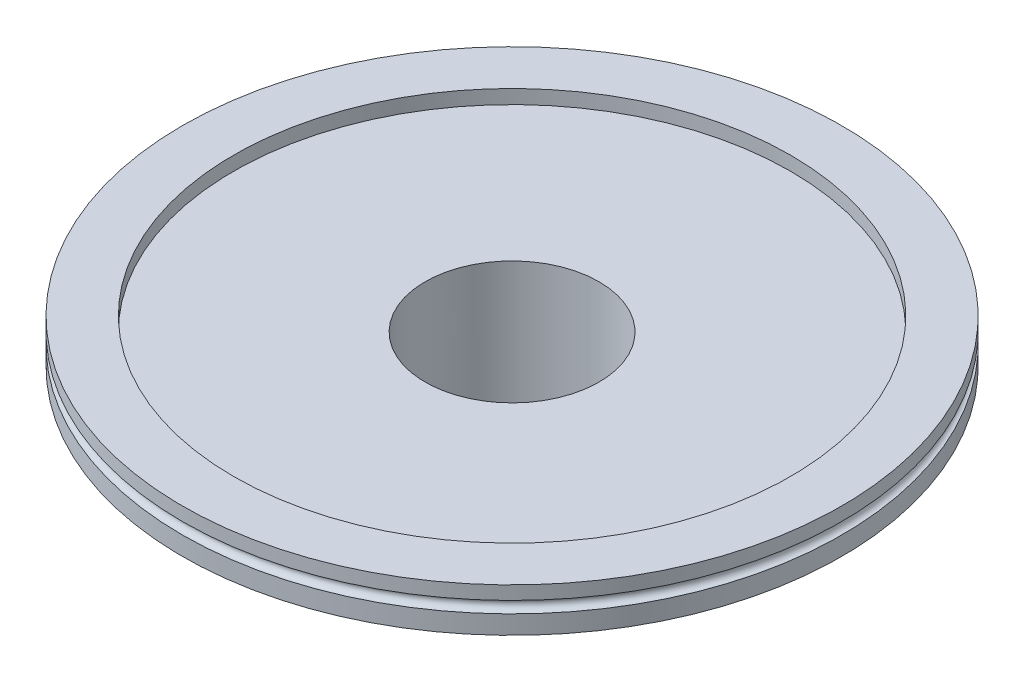
ISO-10303-21;
HEADER;
FILE_DESCRIPTION(('STEP AP214'),'2;1');
FILE_NAME('part.step','',(''),(''),'','','');
FILE_SCHEMA(('AUTOMOTIVE_DESIGN { 1 0 10303 214 1 1 1 1 }'));
ENDSEC;
DATA;
#1=APPLICATION_CONTEXT('core data for automotive mechanical design processes');
#2=APPLICATION_PROTOCOL_DEFINITION('international standard','automotive_design',2000,#1);
#3=PRODUCT_CONTEXT('',#1,'mechanical');
#4=PRODUCT('Part','Part','',(#3));
#5=PRODUCT_RELATED_PRODUCT_CATEGORY('part','',(#4));
#6=PRODUCT_DEFINITION_FORMATION('','',#4);
#7=PRODUCT_DEFINITION_CONTEXT('part definition',#1,'design');
#8=PRODUCT_DEFINITION('design','',#6,#7);
#9=PRODUCT_DEFINITION_SHAPE('','',#8);
#10=(LENGTH_UNIT() NAMED_UNIT(*) SI_UNIT(.MILLI.,.METRE.));
#11=(NAMED_UNIT(*) PLANE_ANGLE_UNIT() SI_UNIT($,.RADIAN.));
#12=(NAMED_UNIT(*) SI_UNIT($,.STERADIAN.) SOLID_ANGLE_UNIT());
#13=UNCERTAINTY_MEASURE_WITH_UNIT(LENGTH_MEASURE(1.E-05),#10,'distance_accuracy_value','');
#14=(GEOMETRIC_REPRESENTATION_CONTEXT(3) GLOBAL_UNCERTAINTY_ASSIGNED_CONTEXT((#13)) GLOBAL_UNIT_ASSIGNED_CONTEXT((#10,
#11,#12)) REPRESENTATION_CONTEXT('',''));
#15=CARTESIAN_POINT('',(0.,0.,0.));
#16=DIRECTION('',(0.,0.,1.));
#17=DIRECTION('',(1.,0.,0.));
#18=AXIS2_PLACEMENT_3D('',#15,#16,#17);
#19=CARTESIAN_POINT('',(0.,5.96900000000001,0.));
#20=DIRECTION('',(0.,1.,0.));
#21=DIRECTION('',(-1.,0.,0.));
#22=AXIS2_PLACEMENT_3D('',#19,#20,#21);
#23=CYLINDRICAL_SURFACE('',#22,89.9999999971);
#24=CARTESIAN_POINT('',(0.,2.28599999999998,0.));
#25=DIRECTION('',(0.,1.,0.));
#26=DIRECTION('',(0.,0.,1.));
#27=AXIS2_PLACEMENT_3D('',#24,#25,#26);
#28=CIRCLE('',#27,89.9999999971);
#29=CARTESIAN_POINT('',(0.,2.28599999999998,89.9999999971));
#30=VERTEX_POINT('',#29);
#31=EDGE_CURVE('E98',#30,#30,#28,.T.);
#32=ORIENTED_EDGE('',*,*,#31,.T.);
#33=EDGE_LOOP('',(#32));
#34=FACE_BOUND('',#33,.T.);
#35=CARTESIAN_POINT('',(0.,5.969,0.));
#36=DIRECTION('',(0.,1.,0.));
#37=DIRECTION('',(-1.,0.,0.));
#38=AXIS2_PLACEMENT_3D('',#35,#36,#37);
#39=CIRCLE('',#38,89.9999999971);
#40=CARTESIAN_POINT('',(-89.9999999971,5.96899999999998,0.));
#41=VERTEX_POINT('',#40);
#42=EDGE_CURVE('E49',#41,#41,#39,.T.);
#43=ORIENTED_EDGE('',*,*,#42,.F.);
#44=EDGE_LOOP('',(#43));
#45=FACE_BOUND('',#44,.T.);
#46=ADVANCED_FACE('F36',(#34,#45),#23,.T.);
#47=CARTESIAN_POINT('',(-89.9999999971,-5.96900000000001,0.));
#48=DIRECTION('',(0.,-1.,0.));
#49=DIRECTION('',(1.,0.,0.));
#50=AXIS2_PLACEMENT_3D('',#47,#48,#49);
#51=PLANE('',#50);
#52=CARTESIAN_POINT('',(0.,-5.96900000000001,0.));
#53=DIRECTION('',(0.,1.,0.));
#54=DIRECTION('',(0.,0.,1.));
#55=AXIS2_PLACEMENT_3D('',#52,#53,#54);
#56=CIRCLE('',#55,87.4599999971);
#57=CARTESIAN_POINT('',(0.,-5.96900000000001,87.4599999971));
#58=VERTEX_POINT('',#57);
#59=EDGE_CURVE('E97',#58,#58,#56,.T.);
#60=ORIENTED_EDGE('',*,*,#59,.T.);
#61=EDGE_LOOP('',(#60));
#62=FACE_BOUND('',#61,.T.);
#63=CARTESIAN_POINT('',(0.,-5.969,0.));
#64=DIRECTION('',(0.,1.,0.));
#65=DIRECTION('',(-1.,0.,0.));
#66=AXIS2_PLACEMENT_3D('',#63,#64,#65);
#67=CIRCLE('',#66,89.9999999971);
#68=CARTESIAN_POINT('',(-89.9999999971,-5.96900000000001,0.));
#69=VERTEX_POINT('',#68);
#70=EDGE_CURVE('E44',#69,#69,#67,.T.);
#71=ORIENTED_EDGE('',*,*,#70,.F.);
#72=EDGE_LOOP('',(#71));
#73=FACE_BOUND('',#72,.T.);
#74=ADVANCED_FACE('F70',(#62,#73),#51,.T.);
#75=CARTESIAN_POINT('',(0.,0.,0.));
#76=DIRECTION('',(0.,1.,0.));
#77=DIRECTION('',(0.,0.,1.));
#78=AXIS2_PLACEMENT_3D('',#75,#76,#77);
#79=CYLINDRICAL_SURFACE('',#78,25.4);
#80=CARTESIAN_POINT('',(0.,-5.969,0.));
#81=DIRECTION('',(0.,-1.,0.));
#82=DIRECTION('',(1.,0.,0.));
#83=AXIS2_PLACEMENT_3D('',#80,#81,#82);
#84=CIRCLE('',#83,25.4);
#85=CARTESIAN_POINT('',(25.4,-5.969,0.));
#86=VERTEX_POINT('',#85);
#87=EDGE_CURVE('E10',#86,#86,#84,.T.);
#88=ORIENTED_EDGE('',*,*,#87,.T.);
#89=EDGE_LOOP('',(#88));
#90=FACE_BOUND('',#89,.T.);
#91=CARTESIAN_POINT('',(0.,-34.925,0.));
#92=DIRECTION('',(0.,-1.,0.));
#93=DIRECTION('',(1.,0.,0.));
#94=AXIS2_PLACEMENT_3D('',#91,#92,#93);
#95=CIRCLE('',#94,25.4);
#96=CARTESIAN_POINT('',(25.4,-34.925,0.));
#97=VERTEX_POINT('',#96);
#98=EDGE_CURVE('E40',#97,#97,#95,.F.);
#99=ORIENTED_EDGE('',*,*,#98,.T.);
#100=EDGE_LOOP('',(#99));
#101=FACE_BOUND('',#100,.T.);
#102=ADVANCED_FACE('F76',(#90,#101),#79,.T.);
#103=CARTESIAN_POINT('',(0.,-5.96900000000001,0.));
#104=DIRECTION('',(0.,1.,0.));
#105=DIRECTION('',(0.,0.,1.));
#106=AXIS2_PLACEMENT_3D('',#103,#104,#105);
#107=CIRCLE('',#106,82.3799999971);
#108=CARTESIAN_POINT('',(0.,-5.96900000000001,82.3799999971));
#109=VERTEX_POINT('',#108);
#110=EDGE_CURVE('E101',#109,#109,#107,.T.);
#111=ORIENTED_EDGE('',*,*,#110,.F.);
#112=EDGE_LOOP('',(#111));
#113=FACE_BOUND('',#112,.T.);
#114=ORIENTED_EDGE('',*,*,#87,.F.);
#115=EDGE_LOOP('',(#114));
#116=FACE_BOUND('',#115,.T.);
#117=ADVANCED_FACE('F38',(#113,#116),#51,.T.);
#118=CARTESIAN_POINT('',(-89.9999999971,5.96899999999999,0.));
#119=DIRECTION('',(0.,1.,0.));
#120=DIRECTION('',(-1.,0.,0.));
#121=AXIS2_PLACEMENT_3D('',#118,#119,#120);
#122=PLANE('',#121);
#123=ORIENTED_EDGE('',*,*,#42,.T.);
#124=EDGE_LOOP('',(#123));
#125=FACE_BOUND('',#124,.T.);
#126=CARTESIAN_POINT('',(0.,5.96900000000001,0.));
#127=DIRECTION('',(0.,-1.,0.));
#128=DIRECTION('',(0.,0.,-1.));
#129=AXIS2_PLACEMENT_3D('',#126,#127,#128);
#130=CIRCLE('',#129,76.0299999971);
#131=CARTESIAN_POINT('',(0.,5.96900000000001,-76.0299999971));
#132=VERTEX_POINT('',#131);
#133=EDGE_CURVE('E54',#132,#132,#130,.T.);
#134=ORIENTED_EDGE('',*,*,#133,.T.);
#135=EDGE_LOOP('',(#134));
#136=FACE_BOUND('',#135,.T.);
#137=ADVANCED_FACE('F66',(#125,#136),#122,.T.);
#138=CARTESIAN_POINT('',(0.,-0.889000000000015,0.));
#139=DIRECTION('',(0.,1.,0.));
#140=DIRECTION('',(0.,0.,1.));
#141=AXIS2_PLACEMENT_3D('',#138,#139,#140);
#142=CIRCLE('',#141,89.9999999971);
#143=CARTESIAN_POINT('',(0.,-0.889000000000015,89.9999999971));
#144=VERTEX_POINT('',#143);
#145=EDGE_CURVE('E93',#144,#144,#142,.T.);
#146=ORIENTED_EDGE('',*,*,#145,.F.);
#147=EDGE_LOOP('',(#146));
#148=FACE_BOUND('',#147,.T.);
#149=ORIENTED_EDGE('',*,*,#70,.T.);
#150=EDGE_LOOP('',(#149));
#151=FACE_BOUND('',#150,.T.);
#152=ADVANCED_FACE('F72',(#148,#151),#23,.T.);
#153=CARTESIAN_POINT('',(0.,5.96900000000001,0.));
#154=DIRECTION('',(0.,-1.,0.));
#155=DIRECTION('',(0.,0.,-1.));
#156=AXIS2_PLACEMENT_3D('',#153,#154,#155);
#157=CYLINDRICAL_SURFACE('',#156,23.749);
#158=CARTESIAN_POINT('',(0.,-37.3888,0.));
#159=DIRECTION('',(0.,1.,0.));
#160=DIRECTION('',(0.,0.,1.));
#161=AXIS2_PLACEMENT_3D('',#158,#159,#160);
#162=CIRCLE('',#161,23.749);
#163=CARTESIAN_POINT('',(0.,-37.3888,23.749));
#164=VERTEX_POINT('',#163);
#165=EDGE_CURVE('E52',#164,#164,#162,.T.);
#166=ORIENTED_EDGE('',*,*,#165,.F.);
#167=EDGE_LOOP('',(#166));
#168=FACE_BOUND('',#167,.T.);
#169=CARTESIAN_POINT('',(0.,2.15900000000001,0.));
#170=DIRECTION('',(0.,-1.,0.));
#171=DIRECTION('',(0.,0.,-1.));
#172=AXIS2_PLACEMENT_3D('',#169,#170,#171);
#173=CIRCLE('',#172,23.749);
#174=CARTESIAN_POINT('',(0.,2.15900000000001,-23.749));
#175=VERTEX_POINT('',#174);
#176=EDGE_CURVE('E60',#175,#175,#173,.T.);
#177=ORIENTED_EDGE('',*,*,#176,.F.);
#178=EDGE_LOOP('',(#177));
#179=FACE_BOUND('',#178,.T.);
#180=ADVANCED_FACE('F81',(#168,#179),#157,.F.);
#181=CARTESIAN_POINT('',(-23.749,2.159,0.));
#182=DIRECTION('',(0.,1.,0.));
#183=DIRECTION('',(0.,0.,1.));
#184=AXIS2_PLACEMENT_3D('',#181,#182,#183);
#185=PLANE('',#184);
#186=CARTESIAN_POINT('',(0.,2.159,0.));
#187=DIRECTION('',(0.,-1.,0.));
#188=DIRECTION('',(0.,0.,-1.));
#189=AXIS2_PLACEMENT_3D('',#186,#187,#188);
#190=CIRCLE('',#189,76.0299999971);
#191=CARTESIAN_POINT('',(0.,2.159,-76.0299999971));
#192=VERTEX_POINT('',#191);
#193=EDGE_CURVE('E57',#192,#192,#190,.T.);
#194=ORIENTED_EDGE('',*,*,#193,.F.);
#195=EDGE_LOOP('',(#194));
#196=FACE_BOUND('',#195,.T.);
#197=ORIENTED_EDGE('',*,*,#176,.T.);
#198=EDGE_LOOP('',(#197));
#199=FACE_BOUND('',#198,.T.);
#200=ADVANCED_FACE('F87',(#196,#199),#185,.T.);
#201=CARTESIAN_POINT('',(0.,5.96900000000001,0.));
#202=DIRECTION('',(0.,-1.,0.));
#203=DIRECTION('',(0.,0.,-1.));
#204=AXIS2_PLACEMENT_3D('',#201,#202,#203);
#205=CYLINDRICAL_SURFACE('',#204,76.0299999971);
#206=ORIENTED_EDGE('',*,*,#193,.T.);
#207=EDGE_LOOP('',(#206));
#208=FACE_BOUND('',#207,.T.);
#209=ORIENTED_EDGE('',*,*,#133,.F.);
#210=EDGE_LOOP('',(#209));
#211=FACE_BOUND('',#210,.T.);
#212=ADVANCED_FACE('F140',(#208,#211),#205,.F.);
#213=CARTESIAN_POINT('',(-23.749,-37.3888,0.));
#214=DIRECTION('',(0.,-1.,0.));
#215=DIRECTION('',(0.,0.,-1.));
#216=AXIS2_PLACEMENT_3D('',#213,#214,#215);
#217=PLANE('',#216);
#218=ORIENTED_EDGE('',*,*,#165,.T.);
#219=EDGE_LOOP('',(#218));
#220=FACE_BOUND('',#219,.T.);
#221=CARTESIAN_POINT('',(0.,-37.3888,0.));
#222=DIRECTION('',(0.,1.,0.));
#223=DIRECTION('',(-1.,0.,0.));
#224=AXIS2_PLACEMENT_3D('',#221,#222,#223);
#225=CIRCLE('',#224,26.1239);
#226=CARTESIAN_POINT('',(-26.1239,-37.3888,0.));
#227=VERTEX_POINT('',#226);
#228=EDGE_CURVE('E124',#227,#227,#225,.T.);
#229=ORIENTED_EDGE('',*,*,#228,.F.);
#230=EDGE_LOOP('',(#229));
#231=FACE_BOUND('',#230,.T.);
#232=ADVANCED_FACE('F134',(#220,#231),#217,.T.);
#233=CARTESIAN_POINT('',(0.,5.96900000000001,0.));
#234=DIRECTION('',(0.,1.,0.));
#235=DIRECTION('',(-1.,0.,0.));
#236=AXIS2_PLACEMENT_3D('',#233,#234,#235);
#237=CYLINDRICAL_SURFACE('',#236,26.1239);
#238=ORIENTED_EDGE('',*,*,#228,.T.);
#239=EDGE_LOOP('',(#238));
#240=FACE_BOUND('',#239,.T.);
#241=CARTESIAN_POINT('',(0.,-40.005,0.));
#242=DIRECTION('',(0.,1.,0.));
#243=DIRECTION('',(-1.,0.,0.));
#244=AXIS2_PLACEMENT_3D('',#241,#242,#243);
#245=CIRCLE('',#244,26.1239);
#246=CARTESIAN_POINT('',(-26.1239,-40.005,0.));
#247=VERTEX_POINT('',#246);
#248=EDGE_CURVE('E122',#247,#247,#245,.T.);
#249=ORIENTED_EDGE('',*,*,#248,.F.);
#250=EDGE_LOOP('',(#249));
#251=FACE_BOUND('',#250,.T.);
#252=ADVANCED_FACE('F152',(#240,#251),#237,.F.);
#253=CARTESIAN_POINT('',(0.,-40.005,0.));
#254=DIRECTION('',(0.,1.,0.));
#255=DIRECTION('',(-1.,0.,0.));
#256=AXIS2_PLACEMENT_3D('',#253,#254,#255);
#257=PLANE('',#256);
#258=CARTESIAN_POINT('',(0.,-40.005,0.));
#259=DIRECTION('',(0.,1.,0.));
#260=DIRECTION('',(-1.,0.,0.));
#261=AXIS2_PLACEMENT_3D('',#258,#259,#260);
#262=CIRCLE('',#261,37.465);
#263=CARTESIAN_POINT('',(-37.465,-40.005,0.));
#264=VERTEX_POINT('',#263);
#265=EDGE_CURVE('E119',#264,#264,#262,.T.);
#266=ORIENTED_EDGE('',*,*,#265,.F.);
#267=EDGE_LOOP('',(#266));
#268=FACE_BOUND('',#267,.T.);
#269=ORIENTED_EDGE('',*,*,#248,.T.);
#270=EDGE_LOOP('',(#269));
#271=FACE_BOUND('',#270,.T.);
#272=ADVANCED_FACE('F157',(#268,#271),#257,.F.);
#273=CARTESIAN_POINT('',(0.,5.96900000000001,0.));
#274=DIRECTION('',(0.,1.,0.));
#275=DIRECTION('',(-1.,0.,0.));
#276=AXIS2_PLACEMENT_3D('',#273,#274,#275);
#277=CYLINDRICAL_SURFACE('',#276,37.465);
#278=CARTESIAN_POINT('',(0.,-36.83,0.));
#279=DIRECTION('',(0.,1.,0.));
#280=DIRECTION('',(-1.,0.,0.));
#281=AXIS2_PLACEMENT_3D('',#278,#279,#280);
#282=CIRCLE('',#281,37.465);
#283=CARTESIAN_POINT('',(-37.465,-36.83,0.));
#284=VERTEX_POINT('',#283);
#285=EDGE_CURVE('E116',#284,#284,#282,.T.);
#286=ORIENTED_EDGE('',*,*,#285,.F.);
#287=EDGE_LOOP('',(#286));
#288=FACE_BOUND('',#287,.T.);
#289=ORIENTED_EDGE('',*,*,#265,.T.);
#290=EDGE_LOOP('',(#289));
#291=FACE_BOUND('',#290,.T.);
#292=ADVANCED_FACE('F160',(#288,#291),#277,.T.);
#293=CARTESIAN_POINT('',(0.,-36.83,0.));
#294=DIRECTION('',(0.,-1.,0.));
#295=DIRECTION('',(1.,0.,0.));
#296=AXIS2_PLACEMENT_3D('',#293,#294,#295);
#297=CONICAL_SURFACE('',#296,37.465,1.30899693899575);
#298=CARTESIAN_POINT('',(0.,-34.925,0.));
#299=DIRECTION('',(0.,1.,0.));
#300=DIRECTION('',(-1.,0.,0.));
#301=AXIS2_PLACEMENT_3D('',#298,#299,#300);
#302=CIRCLE('',#301,30.3554432115812);
#303=CARTESIAN_POINT('',(-30.3554432115812,-34.925,0.));
#304=VERTEX_POINT('',#303);
#305=EDGE_CURVE('E113',#304,#304,#302,.T.);
#306=ORIENTED_EDGE('',*,*,#305,.F.);
#307=EDGE_LOOP('',(#306));
#308=FACE_BOUND('',#307,.T.);
#309=ORIENTED_EDGE('',*,*,#285,.T.);
#310=EDGE_LOOP('',(#309));
#311=FACE_BOUND('',#310,.T.);
#312=ADVANCED_FACE('F164',(#308,#311),#297,.T.);
#313=CARTESIAN_POINT('',(0.,-34.925,0.));
#314=DIRECTION('',(0.,-1.,0.));
#315=DIRECTION('',(1.,0.,0.));
#316=AXIS2_PLACEMENT_3D('',#313,#314,#315);
#317=PLANE('',#316);
#318=ORIENTED_EDGE('',*,*,#98,.F.);
#319=EDGE_LOOP('',(#318));
#320=FACE_BOUND('',#319,.T.);
#321=ORIENTED_EDGE('',*,*,#305,.T.);
#322=EDGE_LOOP('',(#321));
#323=FACE_BOUND('',#322,.T.);
#324=ADVANCED_FACE('F168',(#320,#323),#317,.F.);
#325=CARTESIAN_POINT('',(0.,0.,0.));
#326=DIRECTION('',(0.,1.,0.));
#327=DIRECTION('',(0.,0.,1.));
#328=AXIS2_PLACEMENT_3D('',#325,#326,#327);
#329=CYLINDRICAL_SURFACE('',#328,87.4599999971);
#330=ORIENTED_EDGE('',*,*,#59,.F.);
#331=EDGE_LOOP('',(#330));
#332=FACE_BOUND('',#331,.T.);
#333=CARTESIAN_POINT('',(0.,-3.93700000000001,0.));
#334=DIRECTION('',(0.,1.,0.));
#335=DIRECTION('',(0.,0.,1.));
#336=AXIS2_PLACEMENT_3D('',#333,#334,#335);
#337=CIRCLE('',#336,87.4599999971);
#338=CARTESIAN_POINT('',(0.,-3.93700000000001,87.4599999971));
#339=VERTEX_POINT('',#338);
#340=EDGE_CURVE('E110',#339,#339,#337,.T.);
#341=ORIENTED_EDGE('',*,*,#340,.T.);
#342=EDGE_LOOP('',(#341));
#343=FACE_BOUND('',#342,.T.);
#344=ADVANCED_FACE('F172',(#332,#343),#329,.F.);
#345=CARTESIAN_POINT('',(-87.4599999971,-3.93700000000001,0.));
#346=DIRECTION('',(0.,1.,0.));
#347=DIRECTION('',(0.,0.,1.));
#348=AXIS2_PLACEMENT_3D('',#345,#346,#347);
#349=PLANE('',#348);
#350=ORIENTED_EDGE('',*,*,#340,.F.);
#351=EDGE_LOOP('',(#350));
#352=FACE_BOUND('',#351,.T.);
#353=CARTESIAN_POINT('',(0.,-3.93700000000001,0.));
#354=DIRECTION('',(0.,1.,0.));
#355=DIRECTION('',(0.,0.,1.));
#356=AXIS2_PLACEMENT_3D('',#353,#354,#355);
#357=CIRCLE('',#356,82.3799999971);
#358=CARTESIAN_POINT('',(0.,-3.93700000000001,82.3799999971));
#359=VERTEX_POINT('',#358);
#360=EDGE_CURVE('E107',#359,#359,#357,.T.);
#361=ORIENTED_EDGE('',*,*,#360,.T.);
#362=EDGE_LOOP('',(#361));
#363=FACE_BOUND('',#362,.T.);
#364=ADVANCED_FACE('F176',(#352,#363),#349,.F.);
#365=CARTESIAN_POINT('',(0.,0.,0.));
#366=DIRECTION('',(0.,1.,0.));
#367=DIRECTION('',(0.,0.,1.));
#368=AXIS2_PLACEMENT_3D('',#365,#366,#367);
#369=CYLINDRICAL_SURFACE('',#368,82.3799999971);
#370=ORIENTED_EDGE('',*,*,#360,.F.);
#371=EDGE_LOOP('',(#370));
#372=FACE_BOUND('',#371,.T.);
#373=ORIENTED_EDGE('',*,*,#110,.T.);
#374=EDGE_LOOP('',(#373));
#375=FACE_BOUND('',#374,.T.);
#376=ADVANCED_FACE('F180',(#372,#375),#369,.T.);
#377=CARTESIAN_POINT('',(0.,0.698499999999985,0.));
#378=DIRECTION('',(0.,1.,0.));
#379=DIRECTION('',(0.,0.,1.));
#380=AXIS2_PLACEMENT_3D('',#377,#378,#379);
#381=TOROIDAL_SURFACE('',#380,89.9999999971,1.5875);
#382=ORIENTED_EDGE('',*,*,#31,.F.);
#383=EDGE_LOOP('',(#382));
#384=FACE_BOUND('',#383,.T.);
#385=ORIENTED_EDGE('',*,*,#145,.T.);
#386=EDGE_LOOP('',(#385));
#387=FACE_BOUND('',#386,.T.);
#388=ADVANCED_FACE('F184',(#384,#387),#381,.F.);
#389=CLOSED_SHELL('',(#46,#74,#102,#117,#137,#152,#180,#200,#212,#232,#252,#272,#292,#312,#324,
#344,#364,#376,#388));
#390=MANIFOLD_SOLID_BREP('B2',#389);
#391=ADVANCED_BREP_SHAPE_REPRESENTATION('',(#18,#390),#14);
#392=SHAPE_DEFINITION_REPRESENTATION(#9,#391);
ENDSEC;
END-ISO-10303-21;
